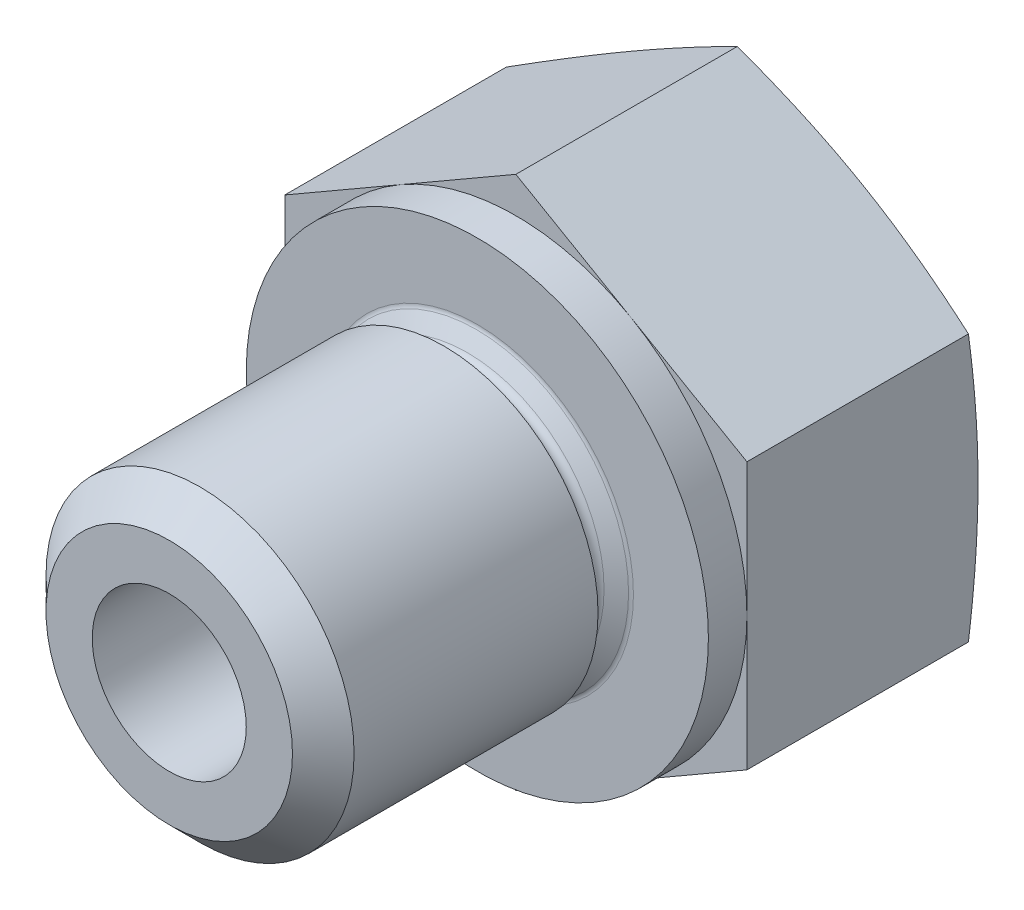
ISO-10303-21;
HEADER;
FILE_DESCRIPTION(('STEP AP214'),'2;1');
FILE_NAME('part.step','',(''),(''),'','','');
FILE_SCHEMA(('AUTOMOTIVE_DESIGN { 1 0 10303 214 1 1 1 1 }'));
ENDSEC;
DATA;
#1=APPLICATION_CONTEXT('core data for automotive mechanical design processes');
#2=APPLICATION_PROTOCOL_DEFINITION('international standard','automotive_design',2000,#1);
#3=PRODUCT_CONTEXT('',#1,'mechanical');
#4=PRODUCT('Part','Part','',(#3));
#5=PRODUCT_RELATED_PRODUCT_CATEGORY('part','',(#4));
#6=PRODUCT_DEFINITION_FORMATION('','',#4);
#7=PRODUCT_DEFINITION_CONTEXT('part definition',#1,'design');
#8=PRODUCT_DEFINITION('design','',#6,#7);
#9=PRODUCT_DEFINITION_SHAPE('','',#8);
#10=(LENGTH_UNIT() NAMED_UNIT(*) SI_UNIT(.MILLI.,.METRE.));
#11=(NAMED_UNIT(*) PLANE_ANGLE_UNIT() SI_UNIT($,.RADIAN.));
#12=(NAMED_UNIT(*) SI_UNIT($,.STERADIAN.) SOLID_ANGLE_UNIT());
#13=UNCERTAINTY_MEASURE_WITH_UNIT(LENGTH_MEASURE(1.E-05),#10,'distance_accuracy_value','');
#14=(GEOMETRIC_REPRESENTATION_CONTEXT(3) GLOBAL_UNCERTAINTY_ASSIGNED_CONTEXT((#13)) GLOBAL_UNIT_ASSIGNED_CONTEXT((#10,
#11,#12)) REPRESENTATION_CONTEXT('',''));
#15=CARTESIAN_POINT('',(0.,0.,0.));
#16=DIRECTION('',(0.,0.,1.));
#17=DIRECTION('',(1.,0.,0.));
#18=AXIS2_PLACEMENT_3D('',#15,#16,#17);
#19=CARTESIAN_POINT('',(0.,0.,15.));
#20=DIRECTION('',(0.,0.,-1.));
#21=DIRECTION('',(-1.,0.,0.));
#22=AXIS2_PLACEMENT_3D('',#19,#20,#21);
#23=CYLINDRICAL_SURFACE('',#22,4.);
#24=CARTESIAN_POINT('',(0.,0.,14.2));
#25=DIRECTION('',(0.,0.,1.));
#26=DIRECTION('',(1.,0.,0.));
#27=AXIS2_PLACEMENT_3D('',#24,#25,#26);
#28=CIRCLE('',#27,4.);
#29=CARTESIAN_POINT('',(4.,0.,14.2));
#30=VERTEX_POINT('',#29);
#31=EDGE_CURVE('E340',#30,#30,#28,.F.);
#32=ORIENTED_EDGE('',*,*,#31,.T.);
#33=EDGE_LOOP('',(#32));
#34=FACE_BOUND('',#33,.T.);
#35=CARTESIAN_POINT('',(0.,0.,7.86602540378445));
#36=DIRECTION('',(0.,0.,-1.));
#37=DIRECTION('',(-1.,0.,0.));
#38=AXIS2_PLACEMENT_3D('',#35,#36,#37);
#39=CIRCLE('',#38,4.);
#40=CARTESIAN_POINT('',(-4.,0.,7.86602540378445));
#41=VERTEX_POINT('',#40);
#42=EDGE_CURVE('E380',#41,#41,#39,.T.);
#43=ORIENTED_EDGE('',*,*,#42,.F.);
#44=EDGE_LOOP('',(#43));
#45=FACE_BOUND('',#44,.T.);
#46=ADVANCED_FACE('F29',(#34,#45),#23,.T.);
#47=CARTESIAN_POINT('',(0.,0.,15.));
#48=DIRECTION('',(0.,0.,1.));
#49=DIRECTION('',(1.,0.,0.));
#50=AXIS2_PLACEMENT_3D('',#47,#48,#49);
#51=PLANE('',#50);
#52=CARTESIAN_POINT('',(0.,0.,15.));
#53=DIRECTION('',(0.,0.,1.));
#54=DIRECTION('',(1.,0.,0.));
#55=AXIS2_PLACEMENT_3D('',#52,#53,#54);
#56=CIRCLE('',#55,2.);
#57=CARTESIAN_POINT('',(2.,0.,15.));
#58=VERTEX_POINT('',#57);
#59=EDGE_CURVE('E264',#58,#58,#56,.T.);
#60=ORIENTED_EDGE('',*,*,#59,.F.);
#61=EDGE_LOOP('',(#60));
#62=FACE_BOUND('',#61,.T.);
#63=CARTESIAN_POINT('',(0.,0.,15.));
#64=DIRECTION('',(0.,0.,1.));
#65=DIRECTION('',(1.,0.,0.));
#66=AXIS2_PLACEMENT_3D('',#63,#64,#65);
#67=CIRCLE('',#66,3.19999999999999);
#68=CARTESIAN_POINT('',(3.19999999999999,0.,15.));
#69=VERTEX_POINT('',#68);
#70=EDGE_CURVE('E337',#69,#69,#67,.T.);
#71=ORIENTED_EDGE('',*,*,#70,.T.);
#72=EDGE_LOOP('',(#71));
#73=FACE_BOUND('',#72,.T.);
#74=ADVANCED_FACE('F139',(#62,#73),#51,.T.);
#75=CARTESIAN_POINT('',(0.,0.,15.));
#76=DIRECTION('',(0.,0.,-1.));
#77=DIRECTION('',(-1.,0.,0.));
#78=AXIS2_PLACEMENT_3D('',#75,#76,#77);
#79=CONICAL_SURFACE('',#78,3.19999999999999,0.785398163397448);
#80=ORIENTED_EDGE('',*,*,#31,.F.);
#81=EDGE_LOOP('',(#80));
#82=FACE_BOUND('',#81,.T.);
#83=ORIENTED_EDGE('',*,*,#70,.F.);
#84=EDGE_LOOP('',(#83));
#85=FACE_BOUND('',#84,.T.);
#86=ADVANCED_FACE('F134',(#82,#85),#79,.T.);
#87=CARTESIAN_POINT('',(0.,0.,15.));
#88=DIRECTION('',(0.,0.,1.));
#89=DIRECTION('',(1.,0.,0.));
#90=AXIS2_PLACEMENT_3D('',#87,#88,#89);
#91=CYLINDRICAL_SURFACE('',#90,2.);
#92=CARTESIAN_POINT('',(0.,0.,12.1534653975958));
#93=DIRECTION('',(0.,0.,1.));
#94=DIRECTION('',(1.,0.,0.));
#95=AXIS2_PLACEMENT_3D('',#92,#93,#94);
#96=CIRCLE('',#95,2.);
#97=CARTESIAN_POINT('',(2.,0.,12.1534653975958));
#98=VERTEX_POINT('',#97);
#99=EDGE_CURVE('E344',#98,#98,#96,.F.);
#100=ORIENTED_EDGE('',*,*,#99,.T.);
#101=EDGE_LOOP('',(#100));
#102=FACE_BOUND('',#101,.T.);
#103=ORIENTED_EDGE('',*,*,#59,.T.);
#104=EDGE_LOOP('',(#103));
#105=FACE_BOUND('',#104,.T.);
#106=ADVANCED_FACE('F124',(#102,#105),#91,.F.);
#107=CARTESIAN_POINT('',(0.,0.,12.));
#108=DIRECTION('',(0.,0.,1.));
#109=DIRECTION('',(1.,0.,0.));
#110=AXIS2_PLACEMENT_3D('',#107,#108,#109);
#111=CONICAL_SURFACE('',#110,2.,1.30899693899574);
#112=CARTESIAN_POINT('',(0.,0.,11.960280232338));
#113=DIRECTION('',(0.,0.,1.));
#114=DIRECTION('',(1.,0.,0.));
#115=AXIS2_PLACEMENT_3D('',#112,#113,#114);
#116=CIRCLE('',#115,1.85176380902051);
#117=CARTESIAN_POINT('',(1.85176380902051,0.,11.960280232338));
#118=VERTEX_POINT('',#117);
#119=EDGE_CURVE('E342',#118,#118,#116,.T.);
#120=ORIENTED_EDGE('',*,*,#119,.T.);
#121=EDGE_LOOP('',(#120));
#122=FACE_BOUND('',#121,.T.);
#123=CARTESIAN_POINT('',(0.,0.,11.4641016151377));
#124=VERTEX_POINT('',#123);
#125=VERTEX_LOOP('',#124);
#126=FACE_BOUND('',#125,.T.);
#127=ADVANCED_FACE('F121',(#122,#126),#111,.F.);
#128=CARTESIAN_POINT('',(0.,0.,12.1534653975958));
#129=DIRECTION('',(0.,0.,1.));
#130=DIRECTION('',(1.,0.,0.));
#131=AXIS2_PLACEMENT_3D('',#128,#129,#130);
#132=TOROIDAL_SURFACE('',#131,1.8,0.2);
#133=ORIENTED_EDGE('',*,*,#99,.F.);
#134=EDGE_LOOP('',(#133));
#135=FACE_BOUND('',#134,.T.);
#136=ORIENTED_EDGE('',*,*,#119,.F.);
#137=EDGE_LOOP('',(#136));
#138=FACE_BOUND('',#137,.T.);
#139=ADVANCED_FACE('F123',(#135,#138),#132,.F.);
#140=CARTESIAN_POINT('',(0.,0.,7.43301270189222));
#141=DIRECTION('',(0.,0.,1.));
#142=DIRECTION('',(1.,0.,0.));
#143=AXIS2_PLACEMENT_3D('',#140,#141,#142);
#144=CONICAL_SURFACE('',#143,3.25,1.04719755119659);
#145=CARTESIAN_POINT('',(0.,0.,7.60621778264911));
#146=DIRECTION('',(0.,0.,1.));
#147=DIRECTION('',(1.,0.,0.));
#148=AXIS2_PLACEMENT_3D('',#145,#146,#147);
#149=CIRCLE('',#148,3.55);
#150=CARTESIAN_POINT('',(3.55,0.,7.60621778264911));
#151=VERTEX_POINT('',#150);
#152=EDGE_CURVE('E11',#151,#151,#149,.T.);
#153=ORIENTED_EDGE('',*,*,#152,.T.);
#154=EDGE_LOOP('',(#153));
#155=FACE_BOUND('',#154,.T.);
#156=ORIENTED_EDGE('',*,*,#42,.T.);
#157=EDGE_LOOP('',(#156));
#158=FACE_BOUND('',#157,.T.);
#159=ADVANCED_FACE('F131',(#155,#158),#144,.T.);
#160=CARTESIAN_POINT('',(0.,0.,7.));
#161=DIRECTION('',(0.,0.,-1.));
#162=DIRECTION('',(-1.,0.,0.));
#163=AXIS2_PLACEMENT_3D('',#160,#161,#162);
#164=CONICAL_SURFACE('',#163,4.,1.04719755119659);
#165=CARTESIAN_POINT('',(0.,0.,7.02679491924311));
#166=DIRECTION('',(0.,0.,-1.));
#167=DIRECTION('',(-1.,0.,0.));
#168=AXIS2_PLACEMENT_3D('',#165,#166,#167);
#169=CIRCLE('',#168,3.95358983848622);
#170=CARTESIAN_POINT('',(-3.95358983848622,0.,7.02679491924311));
#171=VERTEX_POINT('',#170);
#172=EDGE_CURVE('E38',#171,#171,#169,.F.);
#173=ORIENTED_EDGE('',*,*,#172,.T.);
#174=EDGE_LOOP('',(#173));
#175=FACE_BOUND('',#174,.T.);
#176=CARTESIAN_POINT('',(0.,0.,7.25980762113534));
#177=DIRECTION('',(0.,0.,-1.));
#178=DIRECTION('',(-1.,0.,0.));
#179=AXIS2_PLACEMENT_3D('',#176,#177,#178);
#180=CIRCLE('',#179,3.55);
#181=CARTESIAN_POINT('',(-3.55,0.,7.25980762113534));
#182=VERTEX_POINT('',#181);
#183=EDGE_CURVE('E350',#182,#182,#180,.T.);
#184=ORIENTED_EDGE('',*,*,#183,.T.);
#185=EDGE_LOOP('',(#184));
#186=FACE_BOUND('',#185,.T.);
#187=ADVANCED_FACE('F355',(#175,#186),#164,.T.);
#188=CARTESIAN_POINT('',(6.,10.3923048454133,0.));
#189=DIRECTION('',(0.,0.,1.));
#190=DIRECTION('',(1.,0.,0.));
#191=AXIS2_PLACEMENT_3D('',#188,#189,#190);
#192=PLANE('',#191);
#193=CARTESIAN_POINT('',(0.,0.,0.));
#194=DIRECTION('',(0.,0.,1.));
#195=DIRECTION('',(1.,0.,0.));
#196=AXIS2_PLACEMENT_3D('',#193,#194,#195);
#197=CIRCLE('',#196,5.99999999999999);
#198=CARTESIAN_POINT('',(6.,0.,0.));
#199=VERTEX_POINT('',#198);
#200=CARTESIAN_POINT('',(3.,5.19615242270663,0.));
#201=VERTEX_POINT('',#200);
#202=EDGE_CURVE('E268',#199,#201,#197,.T.);
#203=ORIENTED_EDGE('',*,*,#202,.F.);
#204=CARTESIAN_POINT('',(3.00000000000001,-5.19615242270664,0.));
#205=VERTEX_POINT('',#204);
#206=EDGE_CURVE('E273',#205,#199,#197,.T.);
#207=ORIENTED_EDGE('',*,*,#206,.F.);
#208=CARTESIAN_POINT('',(-2.99999999999999,-5.19615242270663,0.));
#209=VERTEX_POINT('',#208);
#210=EDGE_CURVE('E310',#209,#205,#197,.T.);
#211=ORIENTED_EDGE('',*,*,#210,.F.);
#212=CARTESIAN_POINT('',(-6.,0.,0.));
#213=VERTEX_POINT('',#212);
#214=EDGE_CURVE('E512',#213,#209,#197,.T.);
#215=ORIENTED_EDGE('',*,*,#214,.F.);
#216=CARTESIAN_POINT('',(0.,0.,0.));
#217=DIRECTION('',(0.,0.,-1.));
#218=DIRECTION('',(-1.,0.,0.));
#219=AXIS2_PLACEMENT_3D('',#216,#217,#218);
#220=CIRCLE('',#219,6.);
#221=CARTESIAN_POINT('',(-2.99999999999999,5.19615242270663,0.));
#222=VERTEX_POINT('',#221);
#223=EDGE_CURVE('E278',#213,#222,#220,.T.);
#224=ORIENTED_EDGE('',*,*,#223,.T.);
#225=EDGE_CURVE('E271',#201,#222,#197,.T.);
#226=ORIENTED_EDGE('',*,*,#225,.F.);
#227=EDGE_LOOP('',(#203,#207,#211,#215,#224,#226));
#228=FACE_BOUND('',#227,.T.);
#229=ADVANCED_FACE('F170',(#228),#192,.F.);
#230=CARTESIAN_POINT('',(0.,0.,0.));
#231=DIRECTION('',(0.,0.,1.));
#232=DIRECTION('',(1.,0.,0.));
#233=AXIS2_PLACEMENT_3D('',#230,#231,#232);
#234=CONICAL_SURFACE('',#233,6.,1.30899693899575);
#235=CARTESIAN_POINT('',(0.000200000000017197,-6.92831870032935,0.248742246845443));
#236=CARTESIAN_POINT('',(-0.248981497145526,-6.7844536958753,0.21017722331364));
#237=CARTESIAN_POINT('',(-0.498614793511685,-6.6403278450196,0.175166525017474));
#238=CARTESIAN_POINT('',(-0.998762998963026,-6.35156714396756,0.113655985732848));
#239=CARTESIAN_POINT('',(-1.24927822450674,-6.2069321110638,0.0871596018027406));
#240=CARTESIAN_POINT('',(-1.74967138922877,-5.91802998271088,0.044224554129253));
#241=CARTESIAN_POINT('',(-1.99954594463651,-5.77376484088259,0.027734687736646));
#242=CARTESIAN_POINT('',(-2.49961371405139,-5.48505057959785,0.00562346210771674));
#243=CARTESIAN_POINT('',(-2.74980685702569,-5.34060150115224,0.));
#244=CARTESIAN_POINT('',(-3.25019314297429,-5.05170334426102,0.));
#245=CARTESIAN_POINT('',(-3.50038628594858,-4.90725426581542,0.00562346210771646));
#246=CARTESIAN_POINT('',(-4.00045405536347,-4.61854000453068,0.0277346877366455));
#247=CARTESIAN_POINT('',(-4.2503286107712,-4.47427486270238,0.0442245541292524));
#248=CARTESIAN_POINT('',(-4.75072177549323,-4.18537273434947,0.0871596018027396));
#249=CARTESIAN_POINT('',(-5.00123700103695,-4.04073770144571,0.113655985732847));
#250=CARTESIAN_POINT('',(-5.50138520648829,-3.75197700039367,0.175166525017473));
#251=CARTESIAN_POINT('',(-5.75101850285445,-3.60785114953797,0.210177223313639));
#252=CARTESIAN_POINT('',(-6.00019999999999,-3.46398614508392,0.248742246845442));
#253=B_SPLINE_CURVE_WITH_KNOTS('',3,(#235,#236,#237,#238,#239,#240,#241,#242,#243,#244,#245,
#246,#247,#248,#249,#250,#251,#252),.UNSPECIFIED.,.F.,.F.,(4,2,2,2,2,2,2,2,4),(0.,
0.870954567248994,1.74226232176161,2.60907321145349,3.47571633871008,4.34235946596667,
5.20917035565855,6.08047811017116,6.95143267742016),.UNSPECIFIED.);
#254=CARTESIAN_POINT('',(0.,-6.92820323027551,0.248711305964278));
#255=VERTEX_POINT('',#254);
#256=EDGE_CURVE('E185',#255,#209,#253,.T.);
#257=ORIENTED_EDGE('',*,*,#256,.T.);
#258=ORIENTED_EDGE('',*,*,#210,.T.);
#259=CARTESIAN_POINT('',(6.0002,-3.46398614508393,0.248742246845444));
#260=CARTESIAN_POINT('',(5.75101850285446,-3.60785114953799,0.210177223313641));
#261=CARTESIAN_POINT('',(5.5013852064883,-3.75197700039368,0.175166525017475));
#262=CARTESIAN_POINT('',(5.00123700103696,-4.04073770144572,0.11365598573285));
#263=CARTESIAN_POINT('',(4.75072177549324,-4.18537273434948,0.0871596018027428));
#264=CARTESIAN_POINT('',(4.25032861077122,-4.47427486270239,0.0442245541292558));
#265=CARTESIAN_POINT('',(4.00045405536348,-4.61854000453069,0.0277346877366491));
#266=CARTESIAN_POINT('',(3.5003862859486,-4.90725426581542,0.00562346210772034));
#267=CARTESIAN_POINT('',(3.2501931429743,-5.05170334426103,0.));
#268=CARTESIAN_POINT('',(2.74980685702571,-5.34060150115225,0.));
#269=CARTESIAN_POINT('',(2.49961371405141,-5.48505057959786,0.00562346210772007));
#270=CARTESIAN_POINT('',(1.99954594463653,-5.7737648408826,0.0277346877366488));
#271=CARTESIAN_POINT('',(1.7496713892288,-5.91802998271089,0.0442245541292557));
#272=CARTESIAN_POINT('',(1.24927822450677,-6.2069321110638,0.0871596018027427));
#273=CARTESIAN_POINT('',(0.998762998963055,-6.35156714396756,0.11365598573285));
#274=CARTESIAN_POINT('',(0.498614793511716,-6.6403278450196,0.175166525017475));
#275=CARTESIAN_POINT('',(0.248981497145558,-6.7844536958753,0.210177223313641));
#276=CARTESIAN_POINT('',(-0.000199999999983446,-6.92831870032935,0.248742246845444));
#277=B_SPLINE_CURVE_WITH_KNOTS('',3,(#259,#260,#261,#262,#263,#264,#265,#266,#267,#268,#269,
#270,#271,#272,#273,#274,#275,#276),.UNSPECIFIED.,.F.,.F.,(4,2,2,2,2,2,2,2,4),(0.,
0.87095456724899,1.7422623217616,2.60907321145347,3.47571633871006,4.34235946596665,
5.20917035565852,6.08047811017114,6.95143267742013),.UNSPECIFIED.);
#278=EDGE_CURVE('E175',#205,#255,#277,.T.);
#279=ORIENTED_EDGE('',*,*,#278,.T.);
#280=EDGE_LOOP('',(#257,#258,#279));
#281=FACE_BOUND('',#280,.T.);
#282=ADVANCED_FACE('F169',(#281),#234,.T.);
#283=CARTESIAN_POINT('',(-5.99999999999999,-9.24898854729539,1.3463616222713));
#284=CARTESIAN_POINT('',(-5.99999999999999,-8.97562256808436,1.28492750108744));
#285=CARTESIAN_POINT('',(-5.99999999999999,-8.7020878436236,1.22423102567367));
#286=CARTESIAN_POINT('',(-5.99999999999999,-8.15459775462719,1.10471203772516));
#287=CARTESIAN_POINT('',(-5.99999999999999,-7.8806423729368,1.04588960386404));
#288=CARTESIAN_POINT('',(-5.99999999999999,-7.33200345837748,0.930470569605924));
#289=CARTESIAN_POINT('',(-5.99999999999999,-7.05731949165269,0.873876024317393));
#290=CARTESIAN_POINT('',(-5.99999999999999,-6.50738548952602,0.763508970370377));
#291=CARTESIAN_POINT('',(-5.99999999999999,-6.23213545878002,0.709736438596468));
#292=CARTESIAN_POINT('',(-5.99999999999999,-5.68350877624754,0.606167221205588));
#293=CARTESIAN_POINT('',(-5.99999999999999,-5.41013820248016,0.556338494199006));
#294=CARTESIAN_POINT('',(-5.99999999999999,-4.8626564907772,0.460938235800128));
#295=CARTESIAN_POINT('',(-5.99999999999999,-4.58854536886943,0.415366613018149));
#296=CARTESIAN_POINT('',(-5.99999999999999,-4.03951162280063,0.32948652368879));
#297=CARTESIAN_POINT('',(-5.99999999999999,-3.7645890542545,0.289177704629235));
#298=CARTESIAN_POINT('',(-5.99999999999999,-3.21386697094035,0.214995784765039));
#299=CARTESIAN_POINT('',(-5.99999999999999,-2.93806745469263,0.181122694825366));
#300=CARTESIAN_POINT('',(-5.99999999999999,-2.38241174829925,0.12074747855014));
#301=CARTESIAN_POINT('',(-5.99999999999999,-2.10254562260175,0.094335449151698));
#302=CARTESIAN_POINT('',(-5.99999999999999,-1.54209201590791,0.0506966656470527));
#303=CARTESIAN_POINT('',(-5.99999999999999,-1.26150455192816,0.0334696968245969));
#304=CARTESIAN_POINT('',(-5.99999999999999,-0.700032591971396,0.00920415712555651));
#305=CARTESIAN_POINT('',(-5.99999999999999,-0.419148339090787,0.00216007463670998));
#306=CARTESIAN_POINT('',(-5.99999999999999,0.142686718057413,-0.00130686982759598));
#307=CARTESIAN_POINT('',(-5.99999999999999,0.423637522239985,0.00227025470072101));
#308=CARTESIAN_POINT('',(-5.99999999999999,0.98654509053797,0.0198555854039825));
#309=CARTESIAN_POINT('',(-5.99999999999999,1.2685002737062,0.0339133851841409));
#310=CARTESIAN_POINT('',(-5.99999999999999,1.83176794354126,0.0716632124556188));
#311=CARTESIAN_POINT('',(-5.99999999999999,2.11308039437829,0.0953557644751897));
#312=CARTESIAN_POINT('',(-5.99999999999999,2.67506362356068,0.151156692528393));
#313=CARTESIAN_POINT('',(-6.,2.95573378402562,0.183271195888484));
#314=CARTESIAN_POINT('',(-6.,3.51616341574007,0.254552845383672));
#315=CARTESIAN_POINT('',(-6.,3.79592289261731,0.293719947851591));
#316=CARTESIAN_POINT('',(-6.,4.42939131183467,0.389084622299516));
#317=CARTESIAN_POINT('',(-6.,4.78283473071591,0.447033715283243));
#318=CARTESIAN_POINT('',(-6.,5.48849831948745,0.569988330014855));
#319=CARTESIAN_POINT('',(-6.,5.84071841182382,0.634994291007009));
#320=CARTESIAN_POINT('',(-6.,6.54420638095486,0.770370765676091));
#321=CARTESIAN_POINT('',(-6.,6.89547401097058,0.840742553389202));
#322=CARTESIAN_POINT('',(-6.,7.59715556146696,0.985559666850986));
#323=CARTESIAN_POINT('',(-6.,7.94756950136082,1.06000489904771));
#324=CARTESIAN_POINT('',(-6.,8.64794646714827,1.21207832467827));
#325=CARTESIAN_POINT('',(-6.,8.99790904121065,1.2897085917958));
#326=CARTESIAN_POINT('',(-6.,9.69728231793058,1.44741626045598));
#327=CARTESIAN_POINT('',(-6.,10.0466930182778,1.52749367221479));
#328=CARTESIAN_POINT('',(-6.,11.094159666675,1.77056519675583));
#329=CARTESIAN_POINT('',(-6.,11.7915508331276,1.93642080350017));
#330=CARTESIAN_POINT('',(-6.,13.1734648415522,2.27019749642576));
#331=CARTESIAN_POINT('',(-6.,13.8580074351058,2.43803735784279));
#332=CARTESIAN_POINT('',(-6.,15.2263181727719,2.77696250633123));
#333=CARTESIAN_POINT('',(-6.,15.9100862832085,2.94804792918726));
#334=CARTESIAN_POINT('',(-6.,17.275681093643,3.29215109378889));
#335=CARTESIAN_POINT('',(-6.,17.9575089419484,3.46516428839912));
#336=CARTESIAN_POINT('',(-6.,19.3206958317525,3.81287956868389));
#337=CARTESIAN_POINT('',(-6.,20.0020548960667,3.98758156486023));
#338=CARTESIAN_POINT('',(-6.,20.6832674086278,4.1628477961381));
#339=B_SPLINE_CURVE_WITH_KNOTS('',3,(#283,#284,#285,#286,#287,#288,#289,#290,#291,#292,#293,
#294,#295,#296,#297,#298,#299,#300,#301,#302,#303,#304,#305,#306,#307,#308,#309,#310,#311,#312,
#313,#314,#315,#316,#317,#318,#319,#320,#321,#322,#323,#324,#325,#326,#327,#328,#329,#330,#331,
#332,#333,#334,#335,#336,#337,#338),.UNSPECIFIED.,.F.,.F.,(4,2,2,2,2,2,2,2,2,2,2,2,2,2,2,2,2,2,
2,2,2,2,2,2,2,2,2,4),(0.,0.84055551576652,1.68114627228024,2.52249507890419,3.3638369928709,
4.19743435980456,5.03101382731382,5.86453743147664,6.69806244280372,7.54126000213232,
8.38443784943429,9.22715914527355,10.0698793702788,10.9166127839378,11.7633923010208,
12.6107896035034,13.4581816593846,14.5325692122793,15.6070236772163,16.6817340546685,
17.7564197603494,18.8318166252303,19.9072179802174,22.0577114376819,24.1721572983266,
26.2866918170398,28.3969987570145,30.5071944675776),.UNSPECIFIED.);
#340=CARTESIAN_POINT('',(-5.99999999999999,-3.46410161513776,0.248711305964277));
#341=VERTEX_POINT('',#340);
#342=EDGE_CURVE('E197',#341,#213,#339,.T.);
#343=ORIENTED_EDGE('',*,*,#342,.T.);
#344=ORIENTED_EDGE('',*,*,#214,.T.);
#345=EDGE_CURVE('E294',#209,#341,#253,.T.);
#346=ORIENTED_EDGE('',*,*,#345,.T.);
#347=EDGE_LOOP('',(#343,#344,#346));
#348=FACE_BOUND('',#347,.T.);
#349=ADVANCED_FACE('F167',(#348),#234,.T.);
#350=CARTESIAN_POINT('',(-6.0002,3.46398614508392,0.248742246845443));
#351=CARTESIAN_POINT('',(-5.75101850285445,3.60785114953797,0.21017722331364));
#352=CARTESIAN_POINT('',(-5.50138520648829,3.75197700039367,0.175166525017474));
#353=CARTESIAN_POINT('',(-5.00123700103695,4.04073770144571,0.113655985732848));
#354=CARTESIAN_POINT('',(-4.75072177549324,4.18537273434947,0.0871596018027409));
#355=CARTESIAN_POINT('',(-4.25032861077121,4.47427486270238,0.0442245541292537));
#356=CARTESIAN_POINT('',(-4.00045405536347,4.61854000453068,0.0277346877366471));
#357=CARTESIAN_POINT('',(-3.50038628594859,4.90725426581542,0.0056234621077181));
#358=CARTESIAN_POINT('',(-3.25019314297429,5.05170334426103,0.));
#359=CARTESIAN_POINT('',(-2.7498068570257,5.34060150115224,0.));
#360=CARTESIAN_POINT('',(-2.4996137140514,5.48505057959785,0.00562346210771787));
#361=CARTESIAN_POINT('',(-1.99954594463652,5.77376484088259,0.027734687736647));
#362=CARTESIAN_POINT('',(-1.74967138922878,5.91802998271088,0.0442245541292539));
#363=CARTESIAN_POINT('',(-1.24927822450675,6.2069321110638,0.0871596018027413));
#364=CARTESIAN_POINT('',(-0.998762998963036,6.35156714396756,0.113655985732849));
#365=CARTESIAN_POINT('',(-0.498614793511695,6.6403278450196,0.175166525017474));
#366=CARTESIAN_POINT('',(-0.248981497145536,6.7844536958753,0.21017722331364));
#367=CARTESIAN_POINT('',(0.000200000000006073,6.92831870032935,0.248742246845444));
#368=B_SPLINE_CURVE_WITH_KNOTS('',3,(#350,#351,#352,#353,#354,#355,#356,#357,#358,#359,#360,
#361,#362,#363,#364,#365,#366,#367),.UNSPECIFIED.,.F.,.F.,(4,2,2,2,2,2,2,2,4),(0.,
0.870954567248994,1.74226232176161,2.60907321145348,3.47571633871008,4.34235946596667,
5.20917035565854,6.08047811017116,6.95143267742015),.UNSPECIFIED.);
#369=CARTESIAN_POINT('',(-6.,3.46410161513776,0.248711305964278));
#370=VERTEX_POINT('',#369);
#371=EDGE_CURVE('E516',#370,#222,#368,.T.);
#372=ORIENTED_EDGE('',*,*,#371,.T.);
#373=ORIENTED_EDGE('',*,*,#223,.F.);
#374=EDGE_CURVE('E300',#213,#370,#339,.T.);
#375=ORIENTED_EDGE('',*,*,#374,.T.);
#376=EDGE_LOOP('',(#372,#373,#375));
#377=FACE_BOUND('',#376,.T.);
#378=ADVANCED_FACE('F162',(#377),#234,.T.);
#379=CARTESIAN_POINT('',(0.,6.92820323027551,0.248711305964278));
#380=VERTEX_POINT('',#379);
#381=EDGE_CURVE('E208',#222,#380,#368,.T.);
#382=ORIENTED_EDGE('',*,*,#381,.T.);
#383=CARTESIAN_POINT('',(-0.000199999999993069,6.92831870032935,0.248742246845444));
#384=CARTESIAN_POINT('',(0.248981497145548,6.7844536958753,0.21017722331364));
#385=CARTESIAN_POINT('',(0.498614793511707,6.6403278450196,0.175166525017475));
#386=CARTESIAN_POINT('',(0.998762998963047,6.35156714396756,0.113655985732849));
#387=CARTESIAN_POINT('',(1.24927822450676,6.2069321110638,0.0871596018027417));
#388=CARTESIAN_POINT('',(1.74967138922879,5.91802998271089,0.0442245541292545));
#389=CARTESIAN_POINT('',(1.99954594463652,5.77376484088259,0.0277346877366476));
#390=CARTESIAN_POINT('',(2.49961371405141,5.48505057959786,0.00562346210771854));
#391=CARTESIAN_POINT('',(2.7498068570257,5.34060150115225,0.));
#392=CARTESIAN_POINT('',(3.2501931429743,5.05170334426103,0.));
#393=CARTESIAN_POINT('',(3.5003862859486,4.90725426581542,0.00562346210771819));
#394=CARTESIAN_POINT('',(4.00045405536348,4.61854000453068,0.0277346877366468));
#395=CARTESIAN_POINT('',(4.25032861077121,4.47427486270239,0.0442245541292535));
#396=CARTESIAN_POINT('',(4.75072177549324,4.18537273434948,0.0871596018027405));
#397=CARTESIAN_POINT('',(5.00123700103696,4.04073770144571,0.113655985732848));
#398=CARTESIAN_POINT('',(5.5013852064883,3.75197700039367,0.175166525017473));
#399=CARTESIAN_POINT('',(5.75101850285445,3.60785114953798,0.210177223313639));
#400=CARTESIAN_POINT('',(6.00019999999999,3.46398614508392,0.248742246845442));
#401=B_SPLINE_CURVE_WITH_KNOTS('',3,(#383,#384,#385,#386,#387,#388,#389,#390,#391,#392,#393,
#394,#395,#396,#397,#398,#399,#400),.UNSPECIFIED.,.F.,.F.,(4,2,2,2,2,2,2,2,4),(0.,
0.870954567248992,1.74226232176161,2.60907321145348,3.47571633871007,4.34235946596666,
5.20917035565853,6.08047811017115,6.95143267742014),.UNSPECIFIED.);
#402=EDGE_CURVE('E207',#380,#201,#401,.T.);
#403=ORIENTED_EDGE('',*,*,#402,.T.);
#404=ORIENTED_EDGE('',*,*,#225,.T.);
#405=EDGE_LOOP('',(#382,#403,#404));
#406=FACE_BOUND('',#405,.T.);
#407=ADVANCED_FACE('F166',(#406),#234,.T.);
#408=CARTESIAN_POINT('',(6.,-9.24898854756039,1.34636162233087));
#409=CARTESIAN_POINT('',(6.,-8.97562256833863,1.28492750114407));
#410=CARTESIAN_POINT('',(6.,-8.70208784386713,1.22423102572738));
#411=CARTESIAN_POINT('',(6.,-8.15459775484925,1.10471203777308));
#412=CARTESIAN_POINT('',(6.,-7.88064237314811,1.04588960390907));
#413=CARTESIAN_POINT('',(6.,-7.33200345856725,0.930470569645264));
#414=CARTESIAN_POINT('',(6.,-7.05731949183167,0.873876024353912));
#415=CARTESIAN_POINT('',(6.,-6.50738548968337,0.763508970401355));
#416=CARTESIAN_POINT('',(6.,-6.23213545892655,0.709736438624726));
#417=CARTESIAN_POINT('',(6.,-5.68350877637269,0.606167221228622));
#418=CARTESIAN_POINT('',(6.,-5.41013820259475,0.556338494219532));
#419=CARTESIAN_POINT('',(6.,-4.86265649087064,0.460938235815853));
#420=CARTESIAN_POINT('',(6.,-4.58854536895227,0.41536661303158));
#421=CARTESIAN_POINT('',(6.,-4.03951162286222,0.329486523697949));
#422=CARTESIAN_POINT('',(6.,-3.76458905430544,0.289177704636416));
#423=CARTESIAN_POINT('',(6.,-3.21386697096991,0.214995784768701));
#424=CARTESIAN_POINT('',(6.,-2.93806745471148,0.181122694827489));
#425=CARTESIAN_POINT('',(6.,-2.38241174829543,0.120747478549648));
#426=CARTESIAN_POINT('',(6.,-2.10254562258599,0.0943354491501662));
#427=CARTESIAN_POINT('',(6.,-1.54209201586821,0.0506966656442656));
#428=CARTESIAN_POINT('',(6.,-1.26150455187647,0.0334696968215944));
#429=CARTESIAN_POINT('',(6.,-0.700032591895722,0.00920415712305276));
#430=CARTESIAN_POINT('',(6.,-0.419148339003122,0.00216007463491942));
#431=CARTESIAN_POINT('',(6.,0.142686718169018,-0.0013068698270369));
#432=CARTESIAN_POINT('',(6.,0.423637522363539,0.0022702547029166));
#433=CARTESIAN_POINT('',(6.,0.986545090685447,0.0198555854102607));
#434=CARTESIAN_POINT('',(6.,1.26850027386564,0.0339133851928711));
#435=CARTESIAN_POINT('',(6.,1.83176794372454,0.0716632124698582));
#436=CARTESIAN_POINT('',(6.,2.11308039457344,0.0953557644924864));
#437=CARTESIAN_POINT('',(6.,2.67506362377949,0.1511566925522));
#438=CARTESIAN_POINT('',(6.,2.95573378425622,0.183271195915746));
#439=CARTESIAN_POINT('',(6.,3.51616341599419,0.25455284541806));
#440=CARTESIAN_POINT('',(6.,3.79592289288314,0.293719947889651));
#441=CARTESIAN_POINT('',(6.,4.42939131211184,0.389084622343728));
#442=CARTESIAN_POINT('',(6.,4.78283473099274,0.447033715329566));
#443=CARTESIAN_POINT('',(6.,5.48849831976366,0.569988330064891));
#444=CARTESIAN_POINT('',(6.,5.84071841209974,0.634994291058645));
#445=CARTESIAN_POINT('',(6.,6.54420638123025,0.770370765730543));
#446=CARTESIAN_POINT('',(6.,6.89547401124572,0.840742553444866));
#447=CARTESIAN_POINT('',(6.,7.59715556174165,0.985559666908792));
#448=CARTESIAN_POINT('',(6.,7.94756950163531,1.06000489910644));
#449=CARTESIAN_POINT('',(6.,8.64794646742231,1.21207832473863));
#450=CARTESIAN_POINT('',(5.99999999999999,8.99790904148444,1.28970859185686));
#451=CARTESIAN_POINT('',(5.99999999999999,9.69728231820389,1.44741626051828));
#452=CARTESIAN_POINT('',(5.99999999999999,10.0466930185509,1.52749367227764));
#453=CARTESIAN_POINT('',(5.99999999999999,11.0941596669475,1.77056519682012));
#454=CARTESIAN_POINT('',(5.99999999999999,11.7915508333998,1.9364208035652));
#455=CARTESIAN_POINT('',(5.99999999999999,13.1734648418232,2.27019749649188));
#456=CARTESIAN_POINT('',(5.99999999999999,13.858007435376,2.43803735790925));
#457=CARTESIAN_POINT('',(5.99999999999999,15.2263181730405,2.77696250639821));
#458=CARTESIAN_POINT('',(5.99999999999999,15.9100862834764,2.94804792925443));
#459=CARTESIAN_POINT('',(5.99999999999999,17.2756810939097,3.2921510938564));
#460=CARTESIAN_POINT('',(5.99999999999999,17.9575089422146,3.46516428846678));
#461=CARTESIAN_POINT('',(5.99999999999999,19.3206958320178,3.8128795687518));
#462=CARTESIAN_POINT('',(5.99999999999999,20.0020548963316,3.98758156492822));
#463=CARTESIAN_POINT('',(5.99999999999999,20.6832674088923,4.16284779620617));
#464=B_SPLINE_CURVE_WITH_KNOTS('',3,(#408,#409,#410,#411,#412,#413,#414,#415,#416,#417,#418,
#419,#420,#421,#422,#423,#424,#425,#426,#427,#428,#429,#430,#431,#432,#433,#434,#435,#436,#437,
#438,#439,#440,#441,#442,#443,#444,#445,#446,#447,#448,#449,#450,#451,#452,#453,#454,#455,#456,
#457,#458,#459,#460,#461,#462,#463),.UNSPECIFIED.,.F.,.F.,(4,2,2,2,2,2,2,2,2,2,2,2,2,2,2,2,2,2,
2,2,2,2,2,2,2,2,2,4),(0.,0.84055551579985,1.6811462723469,2.52249507900428,3.36383699300443,
4.19743435997058,5.03101382751234,5.86453743170764,6.6980624430672,7.54126000243174,
8.38443784976964,9.22715914564477,10.0698793706859,10.9166127843811,11.7633923015004,
12.6107896040193,13.4581816599368,14.5325692128315,15.6070236777686,16.6817340552208,
17.7564197609017,18.8318166257823,19.9072179807692,22.0577114382331,24.1721572988757,
26.2866918175868,28.3969987575604,30.5071944681223),.UNSPECIFIED.);
#465=CARTESIAN_POINT('',(6.,-3.46410161513777,0.248711305964278));
#466=VERTEX_POINT('',#465);
#467=EDGE_CURVE('E192',#199,#466,#464,.F.);
#468=ORIENTED_EDGE('',*,*,#467,.T.);
#469=EDGE_CURVE('E285',#466,#205,#277,.T.);
#470=ORIENTED_EDGE('',*,*,#469,.T.);
#471=ORIENTED_EDGE('',*,*,#206,.T.);
#472=EDGE_LOOP('',(#468,#470,#471));
#473=FACE_BOUND('',#472,.T.);
#474=ADVANCED_FACE('F308',(#473),#234,.T.);
#475=CARTESIAN_POINT('',(6.,3.46410161513776,0.248711305964277));
#476=VERTEX_POINT('',#475);
#477=EDGE_CURVE('E203',#201,#476,#401,.T.);
#478=ORIENTED_EDGE('',*,*,#477,.T.);
#479=EDGE_CURVE('E296',#476,#199,#464,.F.);
#480=ORIENTED_EDGE('',*,*,#479,.T.);
#481=ORIENTED_EDGE('',*,*,#202,.T.);
#482=EDGE_LOOP('',(#478,#480,#481));
#483=FACE_BOUND('',#482,.T.);
#484=ADVANCED_FACE('F233',(#483),#234,.T.);
#485=CARTESIAN_POINT('',(0.,-6.92820323027551,6.));
#486=DIRECTION('',(-0.5,0.866025403784439,0.));
#487=DIRECTION('',(-0.866025403784439,-0.5,0.));
#488=AXIS2_PLACEMENT_3D('',#485,#486,#487);
#489=PLANE('',#488);
#490=ORIENTED_EDGE('',*,*,#469,.F.);
#491=DIRECTION('',(0.,0.,-1.));
#492=VECTOR('',#491,1.);
#493=CARTESIAN_POINT('',(6.,-3.46410161513777,6.));
#494=LINE('',#493,#492);
#495=CARTESIAN_POINT('',(6.,-3.46410161513777,6.));
#496=VERTEX_POINT('',#495);
#497=EDGE_CURVE('E316',#496,#466,#494,.T.);
#498=ORIENTED_EDGE('',*,*,#497,.F.);
#499=DIRECTION('',(0.866025403784439,0.5,0.));
#500=VECTOR('',#499,1.);
#501=CARTESIAN_POINT('',(0.,-6.92820323027551,6.));
#502=LINE('',#501,#500);
#503=CARTESIAN_POINT('',(3.,-5.19615242270664,6.));
#504=VERTEX_POINT('',#503);
#505=EDGE_CURVE('E324',#504,#496,#502,.T.);
#506=ORIENTED_EDGE('',*,*,#505,.F.);
#507=CARTESIAN_POINT('',(0.,-6.92820323027551,6.));
#508=VERTEX_POINT('',#507);
#509=EDGE_CURVE('E319',#508,#504,#502,.T.);
#510=ORIENTED_EDGE('',*,*,#509,.F.);
#511=DIRECTION('',(0.,0.,-1.));
#512=VECTOR('',#511,1.);
#513=CARTESIAN_POINT('',(0.,-6.92820323027551,6.));
#514=LINE('',#513,#512);
#515=EDGE_CURVE('E318',#508,#255,#514,.T.);
#516=ORIENTED_EDGE('',*,*,#515,.T.);
#517=ORIENTED_EDGE('',*,*,#278,.F.);
#518=EDGE_LOOP('',(#490,#498,#506,#510,#516,#517));
#519=FACE_BOUND('',#518,.T.);
#520=ADVANCED_FACE('F229',(#519),#489,.F.);
#521=CARTESIAN_POINT('',(-5.99999999999999,-3.46410161513776,6.));
#522=DIRECTION('',(0.5,0.866025403784439,0.));
#523=DIRECTION('',(-0.866025403784439,0.5,0.));
#524=AXIS2_PLACEMENT_3D('',#521,#522,#523);
#525=PLANE('',#524);
#526=ORIENTED_EDGE('',*,*,#256,.F.);
#527=ORIENTED_EDGE('',*,*,#515,.F.);
#528=DIRECTION('',(0.866025403784439,-0.5,0.));
#529=VECTOR('',#528,1.);
#530=CARTESIAN_POINT('',(-5.99999999999999,-3.46410161513776,6.));
#531=LINE('',#530,#529);
#532=CARTESIAN_POINT('',(-2.99999999999999,-5.19615242270663,6.));
#533=VERTEX_POINT('',#532);
#534=EDGE_CURVE('E533',#533,#508,#531,.T.);
#535=ORIENTED_EDGE('',*,*,#534,.F.);
#536=CARTESIAN_POINT('',(-5.99999999999999,-3.46410161513776,6.));
#537=VERTEX_POINT('',#536);
#538=EDGE_CURVE('E534',#537,#533,#531,.T.);
#539=ORIENTED_EDGE('',*,*,#538,.F.);
#540=DIRECTION('',(0.,0.,-1.));
#541=VECTOR('',#540,1.);
#542=CARTESIAN_POINT('',(-5.99999999999999,-3.46410161513776,6.));
#543=LINE('',#542,#541);
#544=EDGE_CURVE('E322',#537,#341,#543,.T.);
#545=ORIENTED_EDGE('',*,*,#544,.T.);
#546=ORIENTED_EDGE('',*,*,#345,.F.);
#547=EDGE_LOOP('',(#526,#527,#535,#539,#545,#546));
#548=FACE_BOUND('',#547,.T.);
#549=ADVANCED_FACE('F225',(#548),#525,.F.);
#550=CARTESIAN_POINT('',(-6.,3.46410161513776,6.));
#551=DIRECTION('',(1.,0.,0.));
#552=DIRECTION('',(0.,1.,0.));
#553=AXIS2_PLACEMENT_3D('',#550,#551,#552);
#554=PLANE('',#553);
#555=ORIENTED_EDGE('',*,*,#342,.F.);
#556=ORIENTED_EDGE('',*,*,#544,.F.);
#557=DIRECTION('',(0.,-1.,0.));
#558=VECTOR('',#557,1.);
#559=CARTESIAN_POINT('',(-6.,3.46410161513776,6.));
#560=LINE('',#559,#558);
#561=CARTESIAN_POINT('',(-5.99999999999999,0.,6.));
#562=VERTEX_POINT('',#561);
#563=EDGE_CURVE('E527',#562,#537,#560,.T.);
#564=ORIENTED_EDGE('',*,*,#563,.F.);
#565=CARTESIAN_POINT('',(-6.,3.46410161513776,6.));
#566=VERTEX_POINT('',#565);
#567=EDGE_CURVE('E529',#566,#562,#560,.T.);
#568=ORIENTED_EDGE('',*,*,#567,.F.);
#569=DIRECTION('',(0.,0.,-1.));
#570=VECTOR('',#569,1.);
#571=CARTESIAN_POINT('',(-6.,3.46410161513776,6.));
#572=LINE('',#571,#570);
#573=EDGE_CURVE('E330',#566,#370,#572,.T.);
#574=ORIENTED_EDGE('',*,*,#573,.T.);
#575=ORIENTED_EDGE('',*,*,#374,.F.);
#576=EDGE_LOOP('',(#555,#556,#564,#568,#574,#575));
#577=FACE_BOUND('',#576,.T.);
#578=ADVANCED_FACE('F221',(#577),#554,.F.);
#579=CARTESIAN_POINT('',(0.,6.92820323027551,6.));
#580=DIRECTION('',(0.5,-0.866025403784439,0.));
#581=DIRECTION('',(0.866025403784439,0.5,0.));
#582=AXIS2_PLACEMENT_3D('',#579,#580,#581);
#583=PLANE('',#582);
#584=ORIENTED_EDGE('',*,*,#371,.F.);
#585=ORIENTED_EDGE('',*,*,#573,.F.);
#586=DIRECTION('',(-0.866025403784439,-0.5,0.));
#587=VECTOR('',#586,1.);
#588=CARTESIAN_POINT('',(0.,6.92820323027551,6.));
#589=LINE('',#588,#587);
#590=CARTESIAN_POINT('',(-3.,5.19615242270663,6.));
#591=VERTEX_POINT('',#590);
#592=EDGE_CURVE('E526',#591,#566,#589,.T.);
#593=ORIENTED_EDGE('',*,*,#592,.F.);
#594=CARTESIAN_POINT('',(0.,6.92820323027551,6.));
#595=VERTEX_POINT('',#594);
#596=EDGE_CURVE('E525',#595,#591,#589,.T.);
#597=ORIENTED_EDGE('',*,*,#596,.F.);
#598=DIRECTION('',(0.,0.,-1.));
#599=VECTOR('',#598,1.);
#600=CARTESIAN_POINT('',(0.,6.92820323027551,6.));
#601=LINE('',#600,#599);
#602=EDGE_CURVE('E333',#595,#380,#601,.T.);
#603=ORIENTED_EDGE('',*,*,#602,.T.);
#604=ORIENTED_EDGE('',*,*,#381,.F.);
#605=EDGE_LOOP('',(#584,#585,#593,#597,#603,#604));
#606=FACE_BOUND('',#605,.T.);
#607=ADVANCED_FACE('F217',(#606),#583,.F.);
#608=CARTESIAN_POINT('',(6.,3.46410161513776,6.));
#609=DIRECTION('',(-0.5,-0.866025403784438,0.));
#610=DIRECTION('',(0.866025403784439,-0.5,0.));
#611=AXIS2_PLACEMENT_3D('',#608,#609,#610);
#612=PLANE('',#611);
#613=ORIENTED_EDGE('',*,*,#402,.F.);
#614=ORIENTED_EDGE('',*,*,#602,.F.);
#615=DIRECTION('',(-0.866025403784439,0.5,0.));
#616=VECTOR('',#615,1.);
#617=CARTESIAN_POINT('',(6.,3.46410161513776,6.));
#618=LINE('',#617,#616);
#619=CARTESIAN_POINT('',(3.,5.19615242270664,6.));
#620=VERTEX_POINT('',#619);
#621=EDGE_CURVE('E539',#620,#595,#618,.T.);
#622=ORIENTED_EDGE('',*,*,#621,.F.);
#623=CARTESIAN_POINT('',(6.,3.46410161513776,6.));
#624=VERTEX_POINT('',#623);
#625=EDGE_CURVE('E260',#624,#620,#618,.T.);
#626=ORIENTED_EDGE('',*,*,#625,.F.);
#627=DIRECTION('',(0.,0.,-1.));
#628=VECTOR('',#627,1.);
#629=CARTESIAN_POINT('',(6.,3.46410161513776,6.));
#630=LINE('',#629,#628);
#631=EDGE_CURVE('E311',#624,#476,#630,.T.);
#632=ORIENTED_EDGE('',*,*,#631,.T.);
#633=ORIENTED_EDGE('',*,*,#477,.F.);
#634=EDGE_LOOP('',(#613,#614,#622,#626,#632,#633));
#635=FACE_BOUND('',#634,.T.);
#636=ADVANCED_FACE('F214',(#635),#612,.F.);
#637=CARTESIAN_POINT('',(6.,-3.46410161513777,6.));
#638=DIRECTION('',(-1.,0.,0.));
#639=DIRECTION('',(0.,-1.,0.));
#640=AXIS2_PLACEMENT_3D('',#637,#638,#639);
#641=PLANE('',#640);
#642=ORIENTED_EDGE('',*,*,#479,.F.);
#643=ORIENTED_EDGE('',*,*,#631,.F.);
#644=DIRECTION('',(0.,1.,0.));
#645=VECTOR('',#644,1.);
#646=CARTESIAN_POINT('',(6.,-3.46410161513777,6.));
#647=LINE('',#646,#645);
#648=CARTESIAN_POINT('',(6.,0.,6.));
#649=VERTEX_POINT('',#648);
#650=EDGE_CURVE('E258',#649,#624,#647,.T.);
#651=ORIENTED_EDGE('',*,*,#650,.F.);
#652=EDGE_CURVE('E317',#496,#649,#647,.T.);
#653=ORIENTED_EDGE('',*,*,#652,.F.);
#654=ORIENTED_EDGE('',*,*,#497,.T.);
#655=ORIENTED_EDGE('',*,*,#467,.F.);
#656=EDGE_LOOP('',(#642,#643,#651,#653,#654,#655));
#657=FACE_BOUND('',#656,.T.);
#658=ADVANCED_FACE('F31',(#657),#641,.F.);
#659=CARTESIAN_POINT('',(6.,10.3923048454133,6.));
#660=DIRECTION('',(0.,0.,1.));
#661=DIRECTION('',(1.,0.,0.));
#662=AXIS2_PLACEMENT_3D('',#659,#660,#661);
#663=PLANE('',#662);
#664=CARTESIAN_POINT('',(0.,0.,6.));
#665=DIRECTION('',(0.,0.,1.));
#666=DIRECTION('',(1.,0.,0.));
#667=AXIS2_PLACEMENT_3D('',#664,#665,#666);
#668=CIRCLE('',#667,6.);
#669=EDGE_CURVE('E45',#504,#649,#668,.T.);
#670=ORIENTED_EDGE('',*,*,#669,.F.);
#671=ORIENTED_EDGE('',*,*,#505,.T.);
#672=ORIENTED_EDGE('',*,*,#652,.T.);
#673=EDGE_LOOP('',(#670,#671,#672));
#674=FACE_BOUND('',#673,.T.);
#675=ADVANCED_FACE('F235',(#674),#663,.T.);
#676=EDGE_CURVE('E53',#533,#504,#668,.T.);
#677=ORIENTED_EDGE('',*,*,#676,.F.);
#678=ORIENTED_EDGE('',*,*,#534,.T.);
#679=ORIENTED_EDGE('',*,*,#509,.T.);
#680=EDGE_LOOP('',(#677,#678,#679));
#681=FACE_BOUND('',#680,.T.);
#682=ADVANCED_FACE('F237',(#681),#663,.T.);
#683=EDGE_CURVE('E269',#562,#533,#668,.T.);
#684=ORIENTED_EDGE('',*,*,#683,.F.);
#685=ORIENTED_EDGE('',*,*,#563,.T.);
#686=ORIENTED_EDGE('',*,*,#538,.T.);
#687=EDGE_LOOP('',(#684,#685,#686));
#688=FACE_BOUND('',#687,.T.);
#689=ADVANCED_FACE('F241',(#688),#663,.T.);
#690=EDGE_CURVE('E541',#591,#562,#668,.T.);
#691=ORIENTED_EDGE('',*,*,#690,.F.);
#692=ORIENTED_EDGE('',*,*,#592,.T.);
#693=ORIENTED_EDGE('',*,*,#567,.T.);
#694=EDGE_LOOP('',(#691,#692,#693));
#695=FACE_BOUND('',#694,.T.);
#696=ADVANCED_FACE('F251',(#695),#663,.T.);
#697=EDGE_CURVE('E266',#620,#591,#668,.T.);
#698=ORIENTED_EDGE('',*,*,#697,.F.);
#699=ORIENTED_EDGE('',*,*,#621,.T.);
#700=ORIENTED_EDGE('',*,*,#596,.T.);
#701=EDGE_LOOP('',(#698,#699,#700));
#702=FACE_BOUND('',#701,.T.);
#703=ADVANCED_FACE('F245',(#702),#663,.T.);
#704=EDGE_CURVE('E256',#649,#620,#668,.T.);
#705=ORIENTED_EDGE('',*,*,#704,.F.);
#706=ORIENTED_EDGE('',*,*,#650,.T.);
#707=ORIENTED_EDGE('',*,*,#625,.T.);
#708=EDGE_LOOP('',(#705,#706,#707));
#709=FACE_BOUND('',#708,.T.);
#710=ADVANCED_FACE('F160',(#709),#663,.T.);
#711=CARTESIAN_POINT('',(0.,0.,7.));
#712=DIRECTION('',(0.,0.,-1.));
#713=DIRECTION('',(-1.,0.,0.));
#714=AXIS2_PLACEMENT_3D('',#711,#712,#713);
#715=CYLINDRICAL_SURFACE('',#714,6.);
#716=CARTESIAN_POINT('',(0.,0.,7.));
#717=DIRECTION('',(0.,0.,1.));
#718=DIRECTION('',(1.,0.,0.));
#719=AXIS2_PLACEMENT_3D('',#716,#717,#718);
#720=CIRCLE('',#719,6.);
#721=CARTESIAN_POINT('',(6.,0.,7.));
#722=VERTEX_POINT('',#721);
#723=EDGE_CURVE('E263',#722,#722,#720,.T.);
#724=ORIENTED_EDGE('',*,*,#723,.F.);
#725=EDGE_LOOP('',(#724));
#726=FACE_BOUND('',#725,.T.);
#727=ORIENTED_EDGE('',*,*,#704,.T.);
#728=ORIENTED_EDGE('',*,*,#697,.T.);
#729=ORIENTED_EDGE('',*,*,#690,.T.);
#730=ORIENTED_EDGE('',*,*,#683,.T.);
#731=ORIENTED_EDGE('',*,*,#676,.T.);
#732=ORIENTED_EDGE('',*,*,#669,.T.);
#733=EDGE_LOOP('',(#727,#728,#729,#730,#731,#732));
#734=FACE_BOUND('',#733,.T.);
#735=ADVANCED_FACE('F156',(#726,#734),#715,.T.);
#736=CARTESIAN_POINT('',(0.,0.,7.));
#737=DIRECTION('',(0.,0.,1.));
#738=DIRECTION('',(1.,0.,0.));
#739=AXIS2_PLACEMENT_3D('',#736,#737,#738);
#740=PLANE('',#739);
#741=CARTESIAN_POINT('',(0.,0.,7.));
#742=DIRECTION('',(0.,0.,1.));
#743=DIRECTION('',(1.,0.,0.));
#744=AXIS2_PLACEMENT_3D('',#741,#742,#743);
#745=CIRCLE('',#744,4.05358983848623);
#746=CARTESIAN_POINT('',(4.05358983848623,0.,7.));
#747=VERTEX_POINT('',#746);
#748=EDGE_CURVE('E347',#747,#747,#745,.F.);
#749=ORIENTED_EDGE('',*,*,#748,.T.);
#750=EDGE_LOOP('',(#749));
#751=FACE_BOUND('',#750,.T.);
#752=ORIENTED_EDGE('',*,*,#723,.T.);
#753=EDGE_LOOP('',(#752));
#754=FACE_BOUND('',#753,.T.);
#755=ADVANCED_FACE('F152',(#751,#754),#740,.T.);
#756=CARTESIAN_POINT('',(0.,0.,7.2));
#757=DIRECTION('',(0.,0.,1.));
#758=DIRECTION('',(1.,0.,0.));
#759=AXIS2_PLACEMENT_3D('',#756,#757,#758);
#760=TOROIDAL_SURFACE('',#759,4.05358983848623,0.2);
#761=ORIENTED_EDGE('',*,*,#172,.F.);
#762=EDGE_LOOP('',(#761));
#763=FACE_BOUND('',#762,.T.);
#764=ORIENTED_EDGE('',*,*,#748,.F.);
#765=EDGE_LOOP('',(#764));
#766=FACE_BOUND('',#765,.T.);
#767=ADVANCED_FACE('F155',(#763,#766),#760,.F.);
#768=CARTESIAN_POINT('',(0.,0.,7.43301270189222));
#769=DIRECTION('',(0.,0.,-1.));
#770=DIRECTION('',(-1.,0.,0.));
#771=AXIS2_PLACEMENT_3D('',#768,#769,#770);
#772=TOROIDAL_SURFACE('',#771,3.65,0.2);
#773=ORIENTED_EDGE('',*,*,#152,.F.);
#774=EDGE_LOOP('',(#773));
#775=FACE_BOUND('',#774,.T.);
#776=ORIENTED_EDGE('',*,*,#183,.F.);
#777=EDGE_LOOP('',(#776));
#778=FACE_BOUND('',#777,.T.);
#779=ADVANCED_FACE('F360',(#775,#778),#772,.F.);
#780=CLOSED_SHELL('',(#46,#74,#86,#106,#127,#139,#159,#187,#229,#282,#349,#378,#407,#474,#484,
#520,#549,#578,#607,#636,#658,#675,#682,#689,#696,#703,#710,#735,#755,#767,#779));
#781=MANIFOLD_SOLID_BREP('B2',#780);
#782=ADVANCED_BREP_SHAPE_REPRESENTATION('',(#18,#781),#14);
#783=SHAPE_DEFINITION_REPRESENTATION(#9,#782);
ENDSEC;
END-ISO-10303-21;
